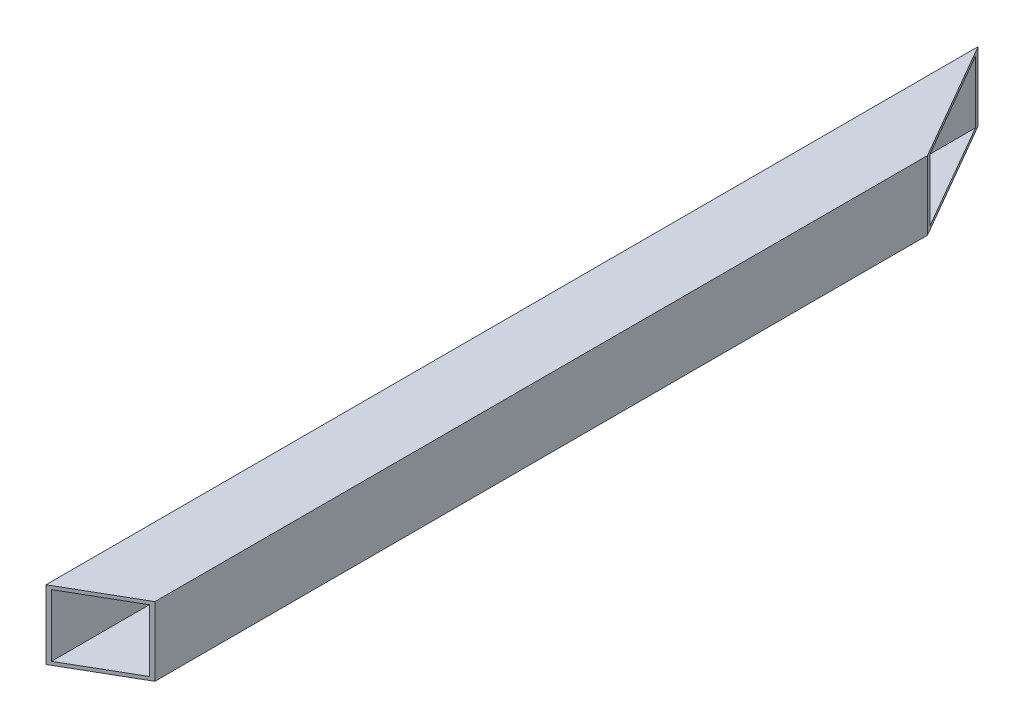
ISO-10303-21;
HEADER;
FILE_DESCRIPTION(('STEP AP214'),'2;1');
FILE_NAME('part.step','',(''),(''),'','','');
FILE_SCHEMA(('AUTOMOTIVE_DESIGN { 1 0 10303 214 1 1 1 1 }'));
ENDSEC;
DATA;
#1=APPLICATION_CONTEXT('core data for automotive mechanical design processes');
#2=APPLICATION_PROTOCOL_DEFINITION('international standard','automotive_design',2000,#1);
#3=PRODUCT_CONTEXT('',#1,'mechanical');
#4=PRODUCT('Part','Part','',(#3));
#5=PRODUCT_RELATED_PRODUCT_CATEGORY('part','',(#4));
#6=PRODUCT_DEFINITION_FORMATION('','',#4);
#7=PRODUCT_DEFINITION_CONTEXT('part definition',#1,'design');
#8=PRODUCT_DEFINITION('design','',#6,#7);
#9=PRODUCT_DEFINITION_SHAPE('','',#8);
#10=(LENGTH_UNIT() NAMED_UNIT(*) SI_UNIT(.MILLI.,.METRE.));
#11=(NAMED_UNIT(*) PLANE_ANGLE_UNIT() SI_UNIT($,.RADIAN.));
#12=(NAMED_UNIT(*) SI_UNIT($,.STERADIAN.) SOLID_ANGLE_UNIT());
#13=UNCERTAINTY_MEASURE_WITH_UNIT(LENGTH_MEASURE(1.E-05),#10,'distance_accuracy_value','');
#14=(GEOMETRIC_REPRESENTATION_CONTEXT(3) GLOBAL_UNCERTAINTY_ASSIGNED_CONTEXT((#13)) GLOBAL_UNIT_ASSIGNED_CONTEXT((#10,
#11,#12)) REPRESENTATION_CONTEXT('',''));
#15=CARTESIAN_POINT('',(0.,0.,0.));
#16=DIRECTION('',(0.,0.,1.));
#17=DIRECTION('',(1.,0.,0.));
#18=AXIS2_PLACEMENT_3D('',#15,#16,#17);
#19=CARTESIAN_POINT('',(1.,19.,270.));
#20=DIRECTION('',(0.,-1.,0.));
#21=DIRECTION('',(0.,0.,-1.));
#22=AXIS2_PLACEMENT_3D('',#19,#20,#21);
#23=PLANE('',#22);
#24=DIRECTION('',(-0.500000000000004,0.,-0.866025403784436));
#25=VECTOR('',#24,1.);
#26=CARTESIAN_POINT('',(117.1634295109,19.,202.933012701891));
#27=LINE('',#26,#25);
#28=CARTESIAN_POINT('',(19.,19.,32.9089653438083));
#29=VERTEX_POINT('',#28);
#30=CARTESIAN_POINT('',(1.,19.,1.7320508075688));
#31=VERTEX_POINT('',#30);
#32=EDGE_CURVE('E11',#29,#31,#27,.T.);
#33=ORIENTED_EDGE('',*,*,#32,.F.);
#34=DIRECTION('',(0.,0.,-1.));
#35=VECTOR('',#34,1.);
#36=CARTESIAN_POINT('',(19.,19.,270.));
#37=LINE('',#36,#35);
#38=CARTESIAN_POINT('',(19.,19.,259.030344885397));
#39=VERTEX_POINT('',#38);
#40=EDGE_CURVE('E142',#39,#29,#37,.T.);
#41=ORIENTED_EDGE('',*,*,#40,.F.);
#42=DIRECTION('',(0.866025403784436,0.,-0.500000000000005));
#43=VECTOR('',#42,1.);
#44=CARTESIAN_POINT('',(0.749999999999995,19.,269.566987298108));
#45=LINE('',#44,#43);
#46=CARTESIAN_POINT('',(1.,19.,269.42264973081));
#47=VERTEX_POINT('',#46);
#48=EDGE_CURVE('E43',#47,#39,#45,.T.);
#49=ORIENTED_EDGE('',*,*,#48,.F.);
#50=DIRECTION('',(0.,0.,-1.));
#51=VECTOR('',#50,1.);
#52=CARTESIAN_POINT('',(1.,19.,270.));
#53=LINE('',#52,#51);
#54=EDGE_CURVE('E148',#47,#31,#53,.T.);
#55=ORIENTED_EDGE('',*,*,#54,.T.);
#56=EDGE_LOOP('',(#33,#41,#49,#55));
#57=FACE_BOUND('',#56,.T.);
#58=ADVANCED_FACE('F35',(#57),#23,.T.);
#59=CARTESIAN_POINT('',(19.,1.,270.));
#60=DIRECTION('',(-1.,0.,0.));
#61=DIRECTION('',(0.,0.,1.));
#62=AXIS2_PLACEMENT_3D('',#59,#60,#61);
#63=PLANE('',#62);
#64=DIRECTION('',(0.,1.,0.));
#65=VECTOR('',#64,1.);
#66=CARTESIAN_POINT('',(19.,1.,32.9089653438083));
#67=LINE('',#66,#65);
#68=CARTESIAN_POINT('',(19.,1.,32.9089653438083));
#69=VERTEX_POINT('',#68);
#70=EDGE_CURVE('E165',#69,#29,#67,.T.);
#71=ORIENTED_EDGE('',*,*,#70,.F.);
#72=DIRECTION('',(0.,0.,-1.));
#73=VECTOR('',#72,1.);
#74=CARTESIAN_POINT('',(19.,1.,270.));
#75=LINE('',#74,#73);
#76=CARTESIAN_POINT('',(19.,1.,259.030344885397));
#77=VERTEX_POINT('',#76);
#78=EDGE_CURVE('E144',#77,#69,#75,.T.);
#79=ORIENTED_EDGE('',*,*,#78,.F.);
#80=DIRECTION('',(0.,-1.,0.));
#81=VECTOR('',#80,1.);
#82=CARTESIAN_POINT('',(19.,1.,259.030344885397));
#83=LINE('',#82,#81);
#84=EDGE_CURVE('E117',#39,#77,#83,.T.);
#85=ORIENTED_EDGE('',*,*,#84,.F.);
#86=ORIENTED_EDGE('',*,*,#40,.T.);
#87=EDGE_LOOP('',(#71,#79,#85,#86));
#88=FACE_BOUND('',#87,.T.);
#89=ADVANCED_FACE('F141',(#88),#63,.T.);
#90=CARTESIAN_POINT('',(1.,1.,270.));
#91=DIRECTION('',(0.,1.,0.));
#92=DIRECTION('',(0.,0.,1.));
#93=AXIS2_PLACEMENT_3D('',#90,#91,#92);
#94=PLANE('',#93);
#95=DIRECTION('',(0.500000000000004,0.,0.866025403784436));
#96=VECTOR('',#95,1.);
#97=CARTESIAN_POINT('',(117.1634295109,1.,202.933012701891));
#98=LINE('',#97,#96);
#99=CARTESIAN_POINT('',(1.,1.,1.7320508075688));
#100=VERTEX_POINT('',#99);
#101=EDGE_CURVE('E167',#100,#69,#98,.T.);
#102=ORIENTED_EDGE('',*,*,#101,.F.);
#103=DIRECTION('',(0.,0.,-1.));
#104=VECTOR('',#103,1.);
#105=CARTESIAN_POINT('',(1.,1.,270.));
#106=LINE('',#105,#104);
#107=CARTESIAN_POINT('',(1.,1.,269.42264973081));
#108=VERTEX_POINT('',#107);
#109=EDGE_CURVE('E150',#108,#100,#106,.T.);
#110=ORIENTED_EDGE('',*,*,#109,.F.);
#111=DIRECTION('',(-0.866025403784436,0.,0.500000000000005));
#112=VECTOR('',#111,1.);
#113=CARTESIAN_POINT('',(0.749999999999995,1.,269.566987298108));
#114=LINE('',#113,#112);
#115=EDGE_CURVE('E145',#77,#108,#114,.T.);
#116=ORIENTED_EDGE('',*,*,#115,.F.);
#117=ORIENTED_EDGE('',*,*,#78,.T.);
#118=EDGE_LOOP('',(#102,#110,#116,#117));
#119=FACE_BOUND('',#118,.T.);
#120=ADVANCED_FACE('F180',(#119),#94,.T.);
#121=CARTESIAN_POINT('',(1.,1.,270.));
#122=DIRECTION('',(1.,0.,0.));
#123=DIRECTION('',(0.,0.,-1.));
#124=AXIS2_PLACEMENT_3D('',#121,#122,#123);
#125=PLANE('',#124);
#126=DIRECTION('',(0.,-1.,0.));
#127=VECTOR('',#126,1.);
#128=CARTESIAN_POINT('',(1.,1.,1.73205080756883));
#129=LINE('',#128,#127);
#130=EDGE_CURVE('E173',#31,#100,#129,.T.);
#131=ORIENTED_EDGE('',*,*,#130,.F.);
#132=ORIENTED_EDGE('',*,*,#54,.F.);
#133=DIRECTION('',(0.,1.,0.));
#134=VECTOR('',#133,1.);
#135=CARTESIAN_POINT('',(1.,1.,269.42264973081));
#136=LINE('',#135,#134);
#137=EDGE_CURVE('E58',#108,#47,#136,.T.);
#138=ORIENTED_EDGE('',*,*,#137,.F.);
#139=ORIENTED_EDGE('',*,*,#109,.T.);
#140=EDGE_LOOP('',(#131,#132,#138,#139));
#141=FACE_BOUND('',#140,.T.);
#142=ADVANCED_FACE('F181',(#141),#125,.T.);
#143=CARTESIAN_POINT('',(0.,-100.,270.));
#144=DIRECTION('',(-0.500000000000005,0.,-0.866025403784436));
#145=DIRECTION('',(-0.866025403784436,0.,0.500000000000005));
#146=AXIS2_PLACEMENT_3D('',#143,#144,#145);
#147=PLANE('',#146);
#148=ORIENTED_EDGE('',*,*,#137,.T.);
#149=ORIENTED_EDGE('',*,*,#48,.T.);
#150=ORIENTED_EDGE('',*,*,#84,.T.);
#151=ORIENTED_EDGE('',*,*,#115,.T.);
#152=EDGE_LOOP('',(#148,#149,#150,#151));
#153=FACE_BOUND('',#152,.T.);
#154=DIRECTION('',(0.,1.,0.));
#155=VECTOR('',#154,1.);
#156=CARTESIAN_POINT('',(20.,-100.,258.452994616207));
#157=LINE('',#156,#155);
#158=CARTESIAN_POINT('',(20.,0.,258.452994616207));
#159=VERTEX_POINT('',#158);
#160=CARTESIAN_POINT('',(20.,20.,258.452994616207));
#161=VERTEX_POINT('',#160);
#162=EDGE_CURVE('E50',#159,#161,#157,.T.);
#163=ORIENTED_EDGE('',*,*,#162,.T.);
#164=DIRECTION('',(-0.866025403784436,0.,0.500000000000005));
#165=VECTOR('',#164,1.);
#166=CARTESIAN_POINT('',(0.,20.,270.));
#167=LINE('',#166,#165);
#168=CARTESIAN_POINT('',(0.,20.,270.));
#169=VERTEX_POINT('',#168);
#170=EDGE_CURVE('E120',#161,#169,#167,.T.);
#171=ORIENTED_EDGE('',*,*,#170,.T.);
#172=DIRECTION('',(0.,-1.,0.));
#173=VECTOR('',#172,1.);
#174=CARTESIAN_POINT('',(0.,0.,270.));
#175=LINE('',#174,#173);
#176=CARTESIAN_POINT('',(0.,0.,270.));
#177=VERTEX_POINT('',#176);
#178=EDGE_CURVE('E125',#169,#177,#175,.T.);
#179=ORIENTED_EDGE('',*,*,#178,.T.);
#180=DIRECTION('',(-0.866025403784436,0.,0.500000000000005));
#181=VECTOR('',#180,1.);
#182=CARTESIAN_POINT('',(0.,0.,270.));
#183=LINE('',#182,#181);
#184=EDGE_CURVE('E162',#159,#177,#183,.T.);
#185=ORIENTED_EDGE('',*,*,#184,.F.);
#186=EDGE_LOOP('',(#163,#171,#179,#185));
#187=FACE_BOUND('',#186,.T.);
#188=ADVANCED_FACE('F131',(#153,#187),#147,.F.);
#189=CARTESIAN_POINT('',(20.,-100.,34.6410161513772));
#190=DIRECTION('',(-0.866025403784436,0.,0.500000000000004));
#191=DIRECTION('',(0.500000000000004,0.,0.866025403784436));
#192=AXIS2_PLACEMENT_3D('',#189,#190,#191);
#193=PLANE('',#192);
#194=ORIENTED_EDGE('',*,*,#130,.T.);
#195=ORIENTED_EDGE('',*,*,#101,.T.);
#196=ORIENTED_EDGE('',*,*,#70,.T.);
#197=ORIENTED_EDGE('',*,*,#32,.T.);
#198=EDGE_LOOP('',(#194,#195,#196,#197));
#199=FACE_BOUND('',#198,.T.);
#200=DIRECTION('',(0.,-1.,0.));
#201=VECTOR('',#200,1.);
#202=CARTESIAN_POINT('',(0.,0.,0.));
#203=LINE('',#202,#201);
#204=CARTESIAN_POINT('',(0.,20.,0.));
#205=VERTEX_POINT('',#204);
#206=CARTESIAN_POINT('',(0.,0.,0.));
#207=VERTEX_POINT('',#206);
#208=EDGE_CURVE('E104',#205,#207,#203,.T.);
#209=ORIENTED_EDGE('',*,*,#208,.F.);
#210=DIRECTION('',(0.500000000000004,0.,0.866025403784436));
#211=VECTOR('',#210,1.);
#212=CARTESIAN_POINT('',(20.,20.,34.6410161513772));
#213=LINE('',#212,#211);
#214=CARTESIAN_POINT('',(20.,20.,34.6410161513772));
#215=VERTEX_POINT('',#214);
#216=EDGE_CURVE('E98',#205,#215,#213,.T.);
#217=ORIENTED_EDGE('',*,*,#216,.T.);
#218=DIRECTION('',(0.,1.,0.));
#219=VECTOR('',#218,1.);
#220=CARTESIAN_POINT('',(20.,-100.,34.6410161513772));
#221=LINE('',#220,#219);
#222=CARTESIAN_POINT('',(20.,0.,34.6410161513772));
#223=VERTEX_POINT('',#222);
#224=EDGE_CURVE('E101',#223,#215,#221,.T.);
#225=ORIENTED_EDGE('',*,*,#224,.F.);
#226=DIRECTION('',(0.500000000000004,0.,0.866025403784436));
#227=VECTOR('',#226,1.);
#228=CARTESIAN_POINT('',(116.9134295109,0.,202.499999999999));
#229=LINE('',#228,#227);
#230=EDGE_CURVE('E152',#207,#223,#229,.T.);
#231=ORIENTED_EDGE('',*,*,#230,.F.);
#232=EDGE_LOOP('',(#209,#217,#225,#231));
#233=FACE_BOUND('',#232,.T.);
#234=ADVANCED_FACE('F100',(#199,#233),#193,.F.);
#235=CARTESIAN_POINT('',(0.,0.,270.));
#236=DIRECTION('',(1.,0.,0.));
#237=DIRECTION('',(0.,0.,-1.));
#238=AXIS2_PLACEMENT_3D('',#235,#236,#237);
#239=PLANE('',#238);
#240=ORIENTED_EDGE('',*,*,#208,.T.);
#241=DIRECTION('',(0.,0.,-1.));
#242=VECTOR('',#241,1.);
#243=CARTESIAN_POINT('',(0.,0.,270.));
#244=LINE('',#243,#242);
#245=EDGE_CURVE('E123',#177,#207,#244,.T.);
#246=ORIENTED_EDGE('',*,*,#245,.F.);
#247=ORIENTED_EDGE('',*,*,#178,.F.);
#248=DIRECTION('',(0.,0.,-1.));
#249=VECTOR('',#248,1.);
#250=CARTESIAN_POINT('',(0.,20.,270.));
#251=LINE('',#250,#249);
#252=EDGE_CURVE('E121',#169,#205,#251,.T.);
#253=ORIENTED_EDGE('',*,*,#252,.T.);
#254=EDGE_LOOP('',(#240,#246,#247,#253));
#255=FACE_BOUND('',#254,.T.);
#256=ADVANCED_FACE('F37',(#255),#239,.F.);
#257=CARTESIAN_POINT('',(0.,0.,270.));
#258=DIRECTION('',(0.,1.,0.));
#259=DIRECTION('',(0.,0.,1.));
#260=AXIS2_PLACEMENT_3D('',#257,#258,#259);
#261=PLANE('',#260);
#262=ORIENTED_EDGE('',*,*,#245,.T.);
#263=ORIENTED_EDGE('',*,*,#230,.T.);
#264=DIRECTION('',(0.,0.,-1.));
#265=VECTOR('',#264,1.);
#266=CARTESIAN_POINT('',(20.,0.,270.));
#267=LINE('',#266,#265);
#268=EDGE_CURVE('E116',#159,#223,#267,.T.);
#269=ORIENTED_EDGE('',*,*,#268,.F.);
#270=ORIENTED_EDGE('',*,*,#184,.T.);
#271=EDGE_LOOP('',(#262,#263,#269,#270));
#272=FACE_BOUND('',#271,.T.);
#273=ADVANCED_FACE('F164',(#272),#261,.F.);
#274=CARTESIAN_POINT('',(20.,0.,270.));
#275=DIRECTION('',(-1.,0.,0.));
#276=DIRECTION('',(0.,0.,1.));
#277=AXIS2_PLACEMENT_3D('',#274,#275,#276);
#278=PLANE('',#277);
#279=ORIENTED_EDGE('',*,*,#268,.T.);
#280=ORIENTED_EDGE('',*,*,#224,.T.);
#281=DIRECTION('',(0.,0.,-1.));
#282=VECTOR('',#281,1.);
#283=CARTESIAN_POINT('',(20.,20.,270.));
#284=LINE('',#283,#282);
#285=EDGE_CURVE('E114',#161,#215,#284,.T.);
#286=ORIENTED_EDGE('',*,*,#285,.F.);
#287=ORIENTED_EDGE('',*,*,#162,.F.);
#288=EDGE_LOOP('',(#279,#280,#286,#287));
#289=FACE_BOUND('',#288,.T.);
#290=ADVANCED_FACE('F113',(#289),#278,.F.);
#291=CARTESIAN_POINT('',(0.,20.,270.));
#292=DIRECTION('',(0.,-1.,0.));
#293=DIRECTION('',(0.,0.,-1.));
#294=AXIS2_PLACEMENT_3D('',#291,#292,#293);
#295=PLANE('',#294);
#296=ORIENTED_EDGE('',*,*,#285,.T.);
#297=ORIENTED_EDGE('',*,*,#216,.F.);
#298=ORIENTED_EDGE('',*,*,#252,.F.);
#299=ORIENTED_EDGE('',*,*,#170,.F.);
#300=EDGE_LOOP('',(#296,#297,#298,#299));
#301=FACE_BOUND('',#300,.T.);
#302=ADVANCED_FACE('F119',(#301),#295,.F.);
#303=CLOSED_SHELL('',(#58,#89,#120,#142,#188,#234,#256,#273,#290,#302));
#304=MANIFOLD_SOLID_BREP('B2',#303);
#305=ADVANCED_BREP_SHAPE_REPRESENTATION('',(#18,#304),#14);
#306=SHAPE_DEFINITION_REPRESENTATION(#9,#305);
ENDSEC;
END-ISO-10303-21;
